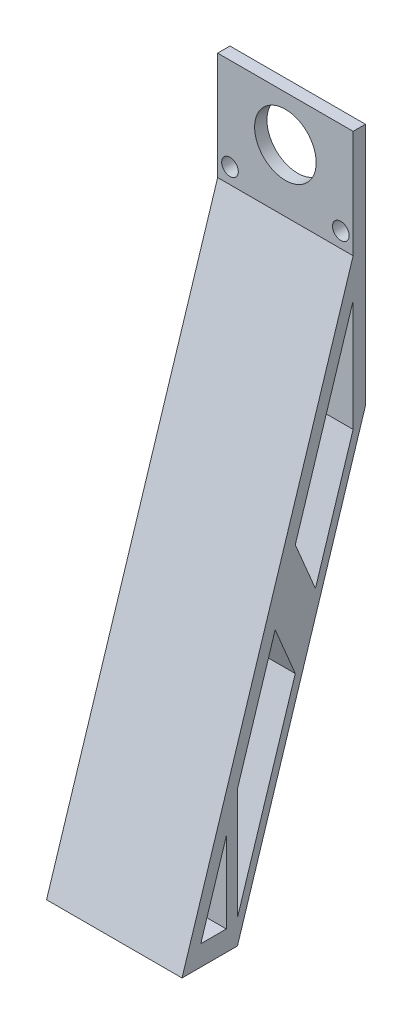
ISO-10303-21;
HEADER;
FILE_DESCRIPTION(('STEP AP214'),'2;1');
FILE_NAME('part.step','',(''),(''),'','','');
FILE_SCHEMA(('AUTOMOTIVE_DESIGN { 1 0 10303 214 1 1 1 1 }'));
ENDSEC;
DATA;
#1=APPLICATION_CONTEXT('core data for automotive mechanical design processes');
#2=APPLICATION_PROTOCOL_DEFINITION('international standard','automotive_design',2000,#1);
#3=PRODUCT_CONTEXT('',#1,'mechanical');
#4=PRODUCT('Part','Part','',(#3));
#5=PRODUCT_RELATED_PRODUCT_CATEGORY('part','',(#4));
#6=PRODUCT_DEFINITION_FORMATION('','',#4);
#7=PRODUCT_DEFINITION_CONTEXT('part definition',#1,'design');
#8=PRODUCT_DEFINITION('design','',#6,#7);
#9=PRODUCT_DEFINITION_SHAPE('','',#8);
#10=(LENGTH_UNIT() NAMED_UNIT(*) SI_UNIT(.MILLI.,.METRE.));
#11=(NAMED_UNIT(*) PLANE_ANGLE_UNIT() SI_UNIT($,.RADIAN.));
#12=(NAMED_UNIT(*) SI_UNIT($,.STERADIAN.) SOLID_ANGLE_UNIT());
#13=UNCERTAINTY_MEASURE_WITH_UNIT(LENGTH_MEASURE(1.E-05),#10,'distance_accuracy_value','');
#14=(GEOMETRIC_REPRESENTATION_CONTEXT(3) GLOBAL_UNCERTAINTY_ASSIGNED_CONTEXT((#13)) GLOBAL_UNIT_ASSIGNED_CONTEXT((#10,
#11,#12)) REPRESENTATION_CONTEXT('',''));
#15=CARTESIAN_POINT('',(0.,0.,0.));
#16=DIRECTION('',(0.,0.,1.));
#17=DIRECTION('',(1.,0.,0.));
#18=AXIS2_PLACEMENT_3D('',#15,#16,#17);
#19=CARTESIAN_POINT('',(1117.6,0.,0.));
#20=DIRECTION('',(0.,-0.302090479419242,-0.953279257219128));
#21=DIRECTION('',(0.,0.953279257219128,-0.302090479419241));
#22=AXIS2_PLACEMENT_3D('',#19,#20,#21);
#23=PLANE('',#22);
#24=DIRECTION('',(-1.,0.,0.));
#25=VECTOR('',#24,1.);
#26=CARTESIAN_POINT('',(1117.6,-1826.20178261922,578.71622386608));
#27=LINE('',#26,#25);
#28=CARTESIAN_POINT('',(1117.6,-1826.20178261922,578.71622386608));
#29=VERTEX_POINT('',#28);
#30=CARTESIAN_POINT('',(0.,-1826.20178261922,578.71622386608));
#31=VERTEX_POINT('',#30);
#32=EDGE_CURVE('E370',#29,#31,#27,.T.);
#33=ORIENTED_EDGE('',*,*,#32,.T.);
#34=DIRECTION('',(0.,-0.953279257219128,0.302090479419241));
#35=VECTOR('',#34,1.);
#36=CARTESIAN_POINT('',(0.,0.,0.));
#37=LINE('',#36,#35);
#38=CARTESIAN_POINT('',(0.,-320.609814382963,101.6));
#39=VERTEX_POINT('',#38);
#40=EDGE_CURVE('E234',#39,#31,#37,.T.);
#41=ORIENTED_EDGE('',*,*,#40,.F.);
#42=DIRECTION('',(-1.,0.,0.));
#43=VECTOR('',#42,1.);
#44=CARTESIAN_POINT('',(1117.6,-320.609814382963,101.6));
#45=LINE('',#44,#43);
#46=CARTESIAN_POINT('',(1117.6,-320.609814382963,101.6));
#47=VERTEX_POINT('',#46);
#48=EDGE_CURVE('E186',#47,#39,#45,.T.);
#49=ORIENTED_EDGE('',*,*,#48,.F.);
#50=DIRECTION('',(0.,-0.953279257219128,0.302090479419241));
#51=VECTOR('',#50,1.);
#52=CARTESIAN_POINT('',(1117.6,0.,0.));
#53=LINE('',#52,#51);
#54=EDGE_CURVE('E224',#47,#29,#53,.T.);
#55=ORIENTED_EDGE('',*,*,#54,.T.);
#56=EDGE_LOOP('',(#33,#41,#49,#55));
#57=FACE_BOUND('',#56,.T.);
#58=ADVANCED_FACE('F36',(#57),#23,.T.);
#59=CARTESIAN_POINT('',(1117.6,-1240.56770828313,101.6));
#60=DIRECTION('',(0.,0.302090479419242,0.953279257219128));
#61=DIRECTION('',(0.,-0.953279257219128,0.302090479419242));
#62=AXIS2_PLACEMENT_3D('',#59,#60,#61);
#63=PLANE('',#62);
#64=DIRECTION('',(-1.,0.,0.));
#65=VECTOR('',#64,1.);
#66=CARTESIAN_POINT('',(1117.6,-2222.10873170461,412.646522925539));
#67=LINE('',#66,#65);
#68=CARTESIAN_POINT('',(1117.6,-2222.10873170461,412.646522925539));
#69=VERTEX_POINT('',#68);
#70=CARTESIAN_POINT('',(0.,-2222.10873170462,412.646522925539));
#71=VERTEX_POINT('',#70);
#72=EDGE_CURVE('E382',#69,#71,#67,.T.);
#73=ORIENTED_EDGE('',*,*,#72,.F.);
#74=DIRECTION('',(0.,0.953279257219128,-0.302090479419242));
#75=VECTOR('',#74,1.);
#76=CARTESIAN_POINT('',(1117.6,-1240.56770828313,101.6));
#77=LINE('',#76,#75);
#78=CARTESIAN_POINT('',(1117.6,-1240.56770828313,101.6));
#79=VERTEX_POINT('',#78);
#80=EDGE_CURVE('E175',#69,#79,#77,.T.);
#81=ORIENTED_EDGE('',*,*,#80,.T.);
#82=DIRECTION('',(-1.,0.,0.));
#83=VECTOR('',#82,1.);
#84=CARTESIAN_POINT('',(1117.6,-1240.56770828313,101.6));
#85=LINE('',#84,#83);
#86=CARTESIAN_POINT('',(0.,-1240.56770828313,101.6));
#87=VERTEX_POINT('',#86);
#88=EDGE_CURVE('E177',#79,#87,#85,.T.);
#89=ORIENTED_EDGE('',*,*,#88,.T.);
#90=DIRECTION('',(0.,0.953279257219128,-0.302090479419242));
#91=VECTOR('',#90,1.);
#92=CARTESIAN_POINT('',(0.,-1240.56770828313,101.6));
#93=LINE('',#92,#91);
#94=EDGE_CURVE('E185',#71,#87,#93,.T.);
#95=ORIENTED_EDGE('',*,*,#94,.F.);
#96=EDGE_LOOP('',(#73,#81,#89,#95));
#97=FACE_BOUND('',#96,.T.);
#98=ADVANCED_FACE('F301',(#97),#63,.T.);
#99=DIRECTION('',(-1.,0.,0.));
#100=VECTOR('',#99,1.);
#101=CARTESIAN_POINT('',(1117.6,-2350.25272743399,744.785924806621));
#102=LINE('',#101,#100);
#103=CARTESIAN_POINT('',(1117.6,-2350.25272743399,744.785924806621));
#104=VERTEX_POINT('',#103);
#105=CARTESIAN_POINT('',(0.,-2350.252727434,744.785924806619));
#106=VERTEX_POINT('',#105);
#107=EDGE_CURVE('E160',#104,#106,#102,.T.);
#108=ORIENTED_EDGE('',*,*,#107,.F.);
#109=CARTESIAN_POINT('',(1117.6,-3331.79375085548,1055.83244773216));
#110=VERTEX_POINT('',#109);
#111=EDGE_CURVE('E170',#104,#110,#53,.T.);
#112=ORIENTED_EDGE('',*,*,#111,.T.);
#113=DIRECTION('',(-1.,0.,0.));
#114=VECTOR('',#113,1.);
#115=CARTESIAN_POINT('',(1117.6,-3331.79375085548,1055.83244773216));
#116=LINE('',#115,#114);
#117=CARTESIAN_POINT('',(0.,-3331.79375085548,1055.83244773216));
#118=VERTEX_POINT('',#117);
#119=EDGE_CURVE('E197',#110,#118,#116,.T.);
#120=ORIENTED_EDGE('',*,*,#119,.T.);
#121=EDGE_CURVE('E236',#106,#118,#37,.T.);
#122=ORIENTED_EDGE('',*,*,#121,.F.);
#123=EDGE_LOOP('',(#108,#112,#120,#122));
#124=FACE_BOUND('',#123,.T.);
#125=ADVANCED_FACE('F304',(#124),#23,.T.);
#126=CARTESIAN_POINT('',(1117.6,-4286.37525856448,1055.83244773216));
#127=DIRECTION('',(0.,1.,0.));
#128=DIRECTION('',(0.,0.,1.));
#129=AXIS2_PLACEMENT_3D('',#126,#127,#128);
#130=PLANE('',#129);
#131=DIRECTION('',(1.,0.,0.));
#132=VECTOR('',#131,1.);
#133=CARTESIAN_POINT('',(1117.6,-4286.37525856448,1147.60027143976));
#134=LINE('',#133,#132);
#135=CARTESIAN_POINT('',(0.,-4286.37525856448,1147.60027143976));
#136=VERTEX_POINT('',#135);
#137=CARTESIAN_POINT('',(1117.6,-4286.37525856448,1147.60027143976));
#138=VERTEX_POINT('',#137);
#139=EDGE_CURVE('E11',#136,#138,#134,.T.);
#140=ORIENTED_EDGE('',*,*,#139,.F.);
#141=DIRECTION('',(0.,0.,-1.));
#142=VECTOR('',#141,1.);
#143=CARTESIAN_POINT('',(0.,-4286.37525856448,1055.83244773216));
#144=LINE('',#143,#142);
#145=CARTESIAN_POINT('',(0.,-4286.37525856448,1358.33560525368));
#146=VERTEX_POINT('',#145);
#147=EDGE_CURVE('E200',#146,#136,#144,.T.);
#148=ORIENTED_EDGE('',*,*,#147,.F.);
#149=DIRECTION('',(-1.,0.,0.));
#150=VECTOR('',#149,1.);
#151=CARTESIAN_POINT('',(1117.6,-4286.37525856448,1358.33560525368));
#152=LINE('',#151,#150);
#153=CARTESIAN_POINT('',(1117.6,-4286.37525856448,1358.33560525368));
#154=VERTEX_POINT('',#153);
#155=EDGE_CURVE('E208',#154,#146,#152,.T.);
#156=ORIENTED_EDGE('',*,*,#155,.F.);
#157=DIRECTION('',(0.,0.,-1.));
#158=VECTOR('',#157,1.);
#159=CARTESIAN_POINT('',(1117.6,-4286.37525856448,1055.83244773216));
#160=LINE('',#159,#158);
#161=EDGE_CURVE('E202',#154,#138,#160,.T.);
#162=ORIENTED_EDGE('',*,*,#161,.T.);
#163=EDGE_LOOP('',(#140,#148,#156,#162));
#164=FACE_BOUND('',#163,.T.);
#165=ADVANCED_FACE('F313',(#164),#130,.T.);
#166=CARTESIAN_POINT('',(1117.6,0.,101.6));
#167=DIRECTION('',(-1.,0.,0.));
#168=DIRECTION('',(0.,0.,1.));
#169=AXIS2_PLACEMENT_3D('',#166,#167,#168);
#170=PLANE('',#169);
#171=DIRECTION('',(0.,-0.922157656081452,-0.3868142413748));
#172=VECTOR('',#171,1.);
#173=CARTESIAN_POINT('',(1117.6,-1826.20178261922,578.71622386608));
#174=LINE('',#173,#172);
#175=EDGE_CURVE('E161',#29,#69,#174,.T.);
#176=ORIENTED_EDGE('',*,*,#175,.F.);
#177=ORIENTED_EDGE('',*,*,#54,.F.);
#178=DIRECTION('',(0.,1.,0.));
#179=VECTOR('',#178,1.);
#180=CARTESIAN_POINT('',(1117.6,-1442.74416472334,101.6));
#181=LINE('',#180,#179);
#182=EDGE_CURVE('E377',#79,#47,#181,.T.);
#183=ORIENTED_EDGE('',*,*,#182,.F.);
#184=ORIENTED_EDGE('',*,*,#80,.F.);
#185=EDGE_LOOP('',(#176,#177,#183,#184));
#186=FACE_BOUND('',#185,.T.);
#187=ORIENTED_EDGE('',*,*,#111,.F.);
#188=DIRECTION('',(0.,0.922157656081452,0.3868142413748));
#189=VECTOR('',#188,1.);
#190=CARTESIAN_POINT('',(1117.6,-2746.15967651939,578.716223866079));
#191=LINE('',#190,#189);
#192=CARTESIAN_POINT('',(1117.6,-2746.15967651939,578.716223866079));
#193=VERTEX_POINT('',#192);
#194=EDGE_CURVE('E156',#193,#104,#191,.T.);
#195=ORIENTED_EDGE('',*,*,#194,.F.);
#196=CARTESIAN_POINT('',(1117.6,-4251.75164475564,1055.83244773216));
#197=VERTEX_POINT('',#196);
#198=EDGE_CURVE('E168',#197,#193,#77,.T.);
#199=ORIENTED_EDGE('',*,*,#198,.F.);
#200=DIRECTION('',(0.,-1.,0.));
#201=VECTOR('',#200,1.);
#202=CARTESIAN_POINT('',(1117.6,-4453.92810119586,1055.83244773216));
#203=LINE('',#202,#201);
#204=EDGE_CURVE('E205',#110,#197,#203,.T.);
#205=ORIENTED_EDGE('',*,*,#204,.F.);
#206=EDGE_LOOP('',(#187,#195,#199,#205));
#207=FACE_BOUND('',#206,.T.);
#208=DIRECTION('',(0.,1.,0.));
#209=VECTOR('',#208,1.);
#210=CARTESIAN_POINT('',(1117.6,-4288.35810024352,1147.60027143976));
#211=LINE('',#210,#209);
#212=CARTESIAN_POINT('',(1117.6,-3621.37706704861,1147.60027143976));
#213=VERTEX_POINT('',#212);
#214=EDGE_CURVE('E192',#138,#213,#211,.T.);
#215=ORIENTED_EDGE('',*,*,#214,.F.);
#216=ORIENTED_EDGE('',*,*,#161,.F.);
#217=EDGE_CURVE('E222',#213,#154,#53,.T.);
#218=ORIENTED_EDGE('',*,*,#217,.F.);
#219=EDGE_LOOP('',(#215,#216,#218));
#220=FACE_BOUND('',#219,.T.);
#221=DIRECTION('',(0.,-0.953279257219128,0.302090479419242));
#222=VECTOR('',#221,1.);
#223=CARTESIAN_POINT('',(1117.6,-1442.74416472334,101.6));
#224=LINE('',#223,#222);
#225=CARTESIAN_POINT('',(1117.6,-1122.13435034038,0.));
#226=VERTEX_POINT('',#225);
#227=CARTESIAN_POINT('',(1117.6,-4453.92810119586,1055.83244773216));
#228=VERTEX_POINT('',#227);
#229=EDGE_CURVE('E179',#226,#228,#224,.T.);
#230=ORIENTED_EDGE('',*,*,#229,.F.);
#231=DIRECTION('',(0.,1.,0.));
#232=VECTOR('',#231,1.);
#233=CARTESIAN_POINT('',(1117.6,0.,0.));
#234=LINE('',#233,#232);
#235=CARTESIAN_POINT('',(1117.6,889.,0.));
#236=VERTEX_POINT('',#235);
#237=EDGE_CURVE('E263',#226,#236,#234,.T.);
#238=ORIENTED_EDGE('',*,*,#237,.T.);
#239=DIRECTION('',(0.,0.,-1.));
#240=VECTOR('',#239,1.);
#241=CARTESIAN_POINT('',(1117.6,889.,101.6));
#242=LINE('',#241,#240);
#243=CARTESIAN_POINT('',(1117.6,889.,101.6));
#244=VERTEX_POINT('',#243);
#245=EDGE_CURVE('E44',#244,#236,#242,.T.);
#246=ORIENTED_EDGE('',*,*,#245,.F.);
#247=DIRECTION('',(0.,1.,0.));
#248=VECTOR('',#247,1.);
#249=CARTESIAN_POINT('',(1117.6,0.,101.6));
#250=LINE('',#249,#248);
#251=CARTESIAN_POINT('',(1117.6,0.,101.6));
#252=VERTEX_POINT('',#251);
#253=EDGE_CURVE('E253',#252,#244,#250,.T.);
#254=ORIENTED_EDGE('',*,*,#253,.F.);
#255=DIRECTION('',(0.,0.953279257219128,-0.302090479419241));
#256=VECTOR('',#255,1.);
#257=CARTESIAN_POINT('',(1117.6,-4453.92810119586,1513.03244773216));
#258=LINE('',#257,#256);
#259=CARTESIAN_POINT('',(1117.6,-4453.92810119586,1513.03244773216));
#260=VERTEX_POINT('',#259);
#261=EDGE_CURVE('E227',#260,#252,#258,.T.);
#262=ORIENTED_EDGE('',*,*,#261,.F.);
#263=DIRECTION('',(0.,0.,-1.));
#264=VECTOR('',#263,1.);
#265=CARTESIAN_POINT('',(1117.6,-4453.92810119586,1513.03244773216));
#266=LINE('',#265,#264);
#267=EDGE_CURVE('E219',#260,#228,#266,.T.);
#268=ORIENTED_EDGE('',*,*,#267,.T.);
#269=EDGE_LOOP('',(#230,#238,#246,#254,#262,#268));
#270=FACE_BOUND('',#269,.T.);
#271=ADVANCED_FACE('F38',(#186,#207,#220,#270),#170,.F.);
#272=CARTESIAN_POINT('',(0.,889.,101.6));
#273=DIRECTION('',(0.,1.,0.));
#274=DIRECTION('',(0.,0.,1.));
#275=AXIS2_PLACEMENT_3D('',#272,#273,#274);
#276=PLANE('',#275);
#277=DIRECTION('',(1.,0.,0.));
#278=VECTOR('',#277,1.);
#279=CARTESIAN_POINT('',(0.,889.,0.));
#280=LINE('',#279,#278);
#281=CARTESIAN_POINT('',(0.,889.,0.));
#282=VERTEX_POINT('',#281);
#283=EDGE_CURVE('E266',#282,#236,#280,.T.);
#284=ORIENTED_EDGE('',*,*,#283,.F.);
#285=DIRECTION('',(0.,0.,-1.));
#286=VECTOR('',#285,1.);
#287=CARTESIAN_POINT('',(0.,889.,101.6));
#288=LINE('',#287,#286);
#289=CARTESIAN_POINT('',(0.,889.,101.6));
#290=VERTEX_POINT('',#289);
#291=EDGE_CURVE('E262',#290,#282,#288,.T.);
#292=ORIENTED_EDGE('',*,*,#291,.F.);
#293=DIRECTION('',(1.,0.,0.));
#294=VECTOR('',#293,1.);
#295=CARTESIAN_POINT('',(0.,889.,101.6));
#296=LINE('',#295,#294);
#297=EDGE_CURVE('E256',#290,#244,#296,.T.);
#298=ORIENTED_EDGE('',*,*,#297,.T.);
#299=ORIENTED_EDGE('',*,*,#245,.T.);
#300=EDGE_LOOP('',(#284,#292,#298,#299));
#301=FACE_BOUND('',#300,.T.);
#302=ADVANCED_FACE('F356',(#301),#276,.T.);
#303=CARTESIAN_POINT('',(0.,0.,101.6));
#304=DIRECTION('',(-1.,0.,0.));
#305=DIRECTION('',(0.,0.,1.));
#306=AXIS2_PLACEMENT_3D('',#303,#304,#305);
#307=PLANE('',#306);
#308=ORIENTED_EDGE('',*,*,#40,.T.);
#309=DIRECTION('',(0.,-0.922157656081452,-0.3868142413748));
#310=VECTOR('',#309,1.);
#311=CARTESIAN_POINT('',(0.,-1826.20178261922,578.71622386608));
#312=LINE('',#311,#310);
#313=EDGE_CURVE('E59',#31,#71,#312,.T.);
#314=ORIENTED_EDGE('',*,*,#313,.T.);
#315=ORIENTED_EDGE('',*,*,#94,.T.);
#316=DIRECTION('',(0.,1.,0.));
#317=VECTOR('',#316,1.);
#318=CARTESIAN_POINT('',(0.,-1442.74416472334,101.6));
#319=LINE('',#318,#317);
#320=EDGE_CURVE('E380',#87,#39,#319,.T.);
#321=ORIENTED_EDGE('',*,*,#320,.T.);
#322=EDGE_LOOP('',(#308,#314,#315,#321));
#323=FACE_BOUND('',#322,.T.);
#324=DIRECTION('',(0.,0.922157656081452,0.3868142413748));
#325=VECTOR('',#324,1.);
#326=CARTESIAN_POINT('',(0.,-2746.15967651939,578.716223866079));
#327=LINE('',#326,#325);
#328=CARTESIAN_POINT('',(0.,-2746.15967651939,578.716223866079));
#329=VERTEX_POINT('',#328);
#330=EDGE_CURVE('E51',#329,#106,#327,.T.);
#331=ORIENTED_EDGE('',*,*,#330,.T.);
#332=ORIENTED_EDGE('',*,*,#121,.T.);
#333=DIRECTION('',(0.,-1.,0.));
#334=VECTOR('',#333,1.);
#335=CARTESIAN_POINT('',(0.,-4453.92810119586,1055.83244773216));
#336=LINE('',#335,#334);
#337=CARTESIAN_POINT('',(0.,-4251.75164475564,1055.83244773216));
#338=VERTEX_POINT('',#337);
#339=EDGE_CURVE('E206',#118,#338,#336,.T.);
#340=ORIENTED_EDGE('',*,*,#339,.T.);
#341=EDGE_CURVE('E187',#338,#329,#93,.T.);
#342=ORIENTED_EDGE('',*,*,#341,.T.);
#343=EDGE_LOOP('',(#331,#332,#340,#342));
#344=FACE_BOUND('',#343,.T.);
#345=ORIENTED_EDGE('',*,*,#147,.T.);
#346=DIRECTION('',(0.,1.,0.));
#347=VECTOR('',#346,1.);
#348=CARTESIAN_POINT('',(0.,-4288.35810024352,1147.60027143976));
#349=LINE('',#348,#347);
#350=CARTESIAN_POINT('',(0.,-3621.37706704861,1147.60027143976));
#351=VERTEX_POINT('',#350);
#352=EDGE_CURVE('E190',#136,#351,#349,.T.);
#353=ORIENTED_EDGE('',*,*,#352,.T.);
#354=EDGE_CURVE('E233',#351,#146,#37,.T.);
#355=ORIENTED_EDGE('',*,*,#354,.T.);
#356=EDGE_LOOP('',(#345,#353,#355));
#357=FACE_BOUND('',#356,.T.);
#358=DIRECTION('',(0.,1.,0.));
#359=VECTOR('',#358,1.);
#360=CARTESIAN_POINT('',(0.,0.,0.));
#361=LINE('',#360,#359);
#362=CARTESIAN_POINT('',(0.,-1122.13435034038,0.));
#363=VERTEX_POINT('',#362);
#364=EDGE_CURVE('E254',#363,#282,#361,.T.);
#365=ORIENTED_EDGE('',*,*,#364,.F.);
#366=DIRECTION('',(0.,-0.953279257219128,0.302090479419242));
#367=VECTOR('',#366,1.);
#368=CARTESIAN_POINT('',(0.,-1442.74416472334,101.6));
#369=LINE('',#368,#367);
#370=CARTESIAN_POINT('',(0.,-4453.92810119586,1055.83244773216));
#371=VERTEX_POINT('',#370);
#372=EDGE_CURVE('E183',#363,#371,#369,.T.);
#373=ORIENTED_EDGE('',*,*,#372,.T.);
#374=DIRECTION('',(0.,0.,-1.));
#375=VECTOR('',#374,1.);
#376=CARTESIAN_POINT('',(0.,-4453.92810119586,1513.03244773216));
#377=LINE('',#376,#375);
#378=CARTESIAN_POINT('',(0.,-4453.92810119586,1513.03244773216));
#379=VERTEX_POINT('',#378);
#380=EDGE_CURVE('E216',#379,#371,#377,.T.);
#381=ORIENTED_EDGE('',*,*,#380,.F.);
#382=DIRECTION('',(0.,0.953279257219128,-0.302090479419241));
#383=VECTOR('',#382,1.);
#384=CARTESIAN_POINT('',(0.,-4453.92810119586,1513.03244773216));
#385=LINE('',#384,#383);
#386=CARTESIAN_POINT('',(0.,0.,101.6));
#387=VERTEX_POINT('',#386);
#388=EDGE_CURVE('E223',#379,#387,#385,.T.);
#389=ORIENTED_EDGE('',*,*,#388,.T.);
#390=DIRECTION('',(0.,1.,0.));
#391=VECTOR('',#390,1.);
#392=CARTESIAN_POINT('',(0.,0.,101.6));
#393=LINE('',#392,#391);
#394=EDGE_CURVE('E259',#387,#290,#393,.T.);
#395=ORIENTED_EDGE('',*,*,#394,.T.);
#396=ORIENTED_EDGE('',*,*,#291,.T.);
#397=EDGE_LOOP('',(#365,#373,#381,#389,#395,#396));
#398=FACE_BOUND('',#397,.T.);
#399=ADVANCED_FACE('F335',(#323,#344,#357,#398),#307,.T.);
#400=CARTESIAN_POINT('',(0.,0.,101.6));
#401=DIRECTION('',(0.,0.,1.));
#402=DIRECTION('',(1.,0.,0.));
#403=AXIS2_PLACEMENT_3D('',#400,#401,#402);
#404=PLANE('',#403);
#405=CARTESIAN_POINT('',(1016.,127.,101.6));
#406=DIRECTION('',(0.,0.,1.));
#407=DIRECTION('',(1.,0.,0.));
#408=AXIS2_PLACEMENT_3D('',#405,#406,#407);
#409=CIRCLE('',#408,68.58);
#410=CARTESIAN_POINT('',(1084.58,127.,101.6));
#411=VERTEX_POINT('',#410);
#412=EDGE_CURVE('E241',#411,#411,#409,.T.);
#413=ORIENTED_EDGE('',*,*,#412,.F.);
#414=EDGE_LOOP('',(#413));
#415=FACE_BOUND('',#414,.T.);
#416=CARTESIAN_POINT('',(101.6,127.,101.6));
#417=DIRECTION('',(0.,0.,1.));
#418=DIRECTION('',(1.,0.,0.));
#419=AXIS2_PLACEMENT_3D('',#416,#417,#418);
#420=CIRCLE('',#419,68.58);
#421=CARTESIAN_POINT('',(170.18,127.,101.6));
#422=VERTEX_POINT('',#421);
#423=EDGE_CURVE('E245',#422,#422,#420,.T.);
#424=ORIENTED_EDGE('',*,*,#423,.F.);
#425=EDGE_LOOP('',(#424));
#426=FACE_BOUND('',#425,.T.);
#427=CARTESIAN_POINT('',(558.8,513.08,101.6));
#428=DIRECTION('',(0.,0.,1.));
#429=DIRECTION('',(1.,0.,0.));
#430=AXIS2_PLACEMENT_3D('',#427,#428,#429);
#431=CIRCLE('',#430,254.);
#432=CARTESIAN_POINT('',(812.8,513.08,101.6));
#433=VERTEX_POINT('',#432);
#434=EDGE_CURVE('E240',#433,#433,#431,.T.);
#435=ORIENTED_EDGE('',*,*,#434,.F.);
#436=EDGE_LOOP('',(#435));
#437=FACE_BOUND('',#436,.T.);
#438=DIRECTION('',(1.,0.,0.));
#439=VECTOR('',#438,1.);
#440=CARTESIAN_POINT('',(0.,0.,101.6));
#441=LINE('',#440,#439);
#442=EDGE_CURVE('E250',#387,#252,#441,.T.);
#443=ORIENTED_EDGE('',*,*,#442,.T.);
#444=ORIENTED_EDGE('',*,*,#253,.T.);
#445=ORIENTED_EDGE('',*,*,#297,.F.);
#446=ORIENTED_EDGE('',*,*,#394,.F.);
#447=EDGE_LOOP('',(#443,#444,#445,#446));
#448=FACE_BOUND('',#447,.T.);
#449=ADVANCED_FACE('F424',(#415,#426,#437,#448),#404,.T.);
#450=CARTESIAN_POINT('',(0.,0.,0.));
#451=DIRECTION('',(0.,0.,1.));
#452=DIRECTION('',(1.,0.,0.));
#453=AXIS2_PLACEMENT_3D('',#450,#451,#452);
#454=PLANE('',#453);
#455=CARTESIAN_POINT('',(1016.,127.,0.));
#456=DIRECTION('',(0.,0.,1.));
#457=DIRECTION('',(1.,0.,0.));
#458=AXIS2_PLACEMENT_3D('',#455,#456,#457);
#459=CIRCLE('',#458,68.58);
#460=CARTESIAN_POINT('',(1084.58,127.,0.));
#461=VERTEX_POINT('',#460);
#462=EDGE_CURVE('E267',#461,#461,#459,.T.);
#463=ORIENTED_EDGE('',*,*,#462,.T.);
#464=EDGE_LOOP('',(#463));
#465=FACE_BOUND('',#464,.T.);
#466=CARTESIAN_POINT('',(101.6,127.,0.));
#467=DIRECTION('',(0.,0.,1.));
#468=DIRECTION('',(1.,0.,0.));
#469=AXIS2_PLACEMENT_3D('',#466,#467,#468);
#470=CIRCLE('',#469,68.58);
#471=CARTESIAN_POINT('',(170.18,127.,0.));
#472=VERTEX_POINT('',#471);
#473=EDGE_CURVE('E276',#472,#472,#470,.T.);
#474=ORIENTED_EDGE('',*,*,#473,.T.);
#475=EDGE_LOOP('',(#474));
#476=FACE_BOUND('',#475,.T.);
#477=CARTESIAN_POINT('',(558.8,513.08,0.));
#478=DIRECTION('',(0.,0.,1.));
#479=DIRECTION('',(1.,0.,0.));
#480=AXIS2_PLACEMENT_3D('',#477,#478,#479);
#481=CIRCLE('',#480,254.);
#482=CARTESIAN_POINT('',(812.8,513.08,0.));
#483=VERTEX_POINT('',#482);
#484=EDGE_CURVE('E244',#483,#483,#481,.T.);
#485=ORIENTED_EDGE('',*,*,#484,.T.);
#486=EDGE_LOOP('',(#485));
#487=FACE_BOUND('',#486,.T.);
#488=ORIENTED_EDGE('',*,*,#237,.F.);
#489=DIRECTION('',(-1.,0.,0.));
#490=VECTOR('',#489,1.);
#491=CARTESIAN_POINT('',(1117.6,-1122.13435034038,0.));
#492=LINE('',#491,#490);
#493=EDGE_CURVE('E375',#226,#363,#492,.T.);
#494=ORIENTED_EDGE('',*,*,#493,.T.);
#495=ORIENTED_EDGE('',*,*,#364,.T.);
#496=ORIENTED_EDGE('',*,*,#283,.T.);
#497=EDGE_LOOP('',(#488,#494,#495,#496));
#498=FACE_BOUND('',#497,.T.);
#499=ADVANCED_FACE('F281',(#465,#476,#487,#498),#454,.F.);
#500=CARTESIAN_POINT('',(558.8,513.08,-391.16));
#501=DIRECTION('',(0.,0.,1.));
#502=DIRECTION('',(1.,0.,0.));
#503=AXIS2_PLACEMENT_3D('',#500,#501,#502);
#504=CYLINDRICAL_SURFACE('',#503,254.);
#505=CARTESIAN_POINT('',(812.8,513.08,101.6));
#506=CARTESIAN_POINT('',(812.8,513.08,100.541666666667));
#507=CARTESIAN_POINT('',(812.8,513.08,99.4833333333333));
#508=CARTESIAN_POINT('',(812.8,513.08,97.3666666666666));
#509=CARTESIAN_POINT('',(812.8,513.08,96.3083333333333));
#510=CARTESIAN_POINT('',(812.8,513.08,94.1916666666666));
#511=CARTESIAN_POINT('',(812.8,513.08,93.1333333333333));
#512=CARTESIAN_POINT('',(812.8,513.08,91.0166666666666));
#513=CARTESIAN_POINT('',(812.8,513.08,89.9583333333333));
#514=CARTESIAN_POINT('',(812.8,513.08,87.8416666666666));
#515=CARTESIAN_POINT('',(812.8,513.08,86.7833333333333));
#516=CARTESIAN_POINT('',(812.8,513.08,84.6666666666666));
#517=CARTESIAN_POINT('',(812.8,513.08,83.6083333333333));
#518=CARTESIAN_POINT('',(812.8,513.08,81.4916666666666));
#519=CARTESIAN_POINT('',(812.8,513.08,80.4333333333333));
#520=CARTESIAN_POINT('',(812.8,513.08,78.3166666666666));
#521=CARTESIAN_POINT('',(812.8,513.08,77.2583333333333));
#522=CARTESIAN_POINT('',(812.8,513.08,75.1416666666667));
#523=CARTESIAN_POINT('',(812.8,513.08,74.0833333333333));
#524=CARTESIAN_POINT('',(812.8,513.08,71.9666666666666));
#525=CARTESIAN_POINT('',(812.8,513.08,70.9083333333333));
#526=CARTESIAN_POINT('',(812.8,513.08,68.7916666666666));
#527=CARTESIAN_POINT('',(812.8,513.08,67.7333333333333));
#528=CARTESIAN_POINT('',(812.8,513.08,65.6166666666666));
#529=CARTESIAN_POINT('',(812.8,513.08,64.5583333333333));
#530=CARTESIAN_POINT('',(812.8,513.08,62.4416666666666));
#531=CARTESIAN_POINT('',(812.8,513.08,61.3833333333333));
#532=CARTESIAN_POINT('',(812.8,513.08,59.2666666666666));
#533=CARTESIAN_POINT('',(812.8,513.08,58.2083333333333));
#534=CARTESIAN_POINT('',(812.8,513.08,56.0916666666666));
#535=CARTESIAN_POINT('',(812.8,513.08,55.0333333333333));
#536=CARTESIAN_POINT('',(812.8,513.08,52.9166666666666));
#537=CARTESIAN_POINT('',(812.8,513.08,51.8583333333333));
#538=CARTESIAN_POINT('',(812.8,513.08,49.7416666666666));
#539=CARTESIAN_POINT('',(812.8,513.08,48.6833333333333));
#540=CARTESIAN_POINT('',(812.8,513.08,46.5666666666666));
#541=CARTESIAN_POINT('',(812.8,513.08,45.5083333333333));
#542=CARTESIAN_POINT('',(812.8,513.08,43.3916666666666));
#543=CARTESIAN_POINT('',(812.8,513.08,42.3333333333333));
#544=CARTESIAN_POINT('',(812.8,513.08,40.2166666666666));
#545=CARTESIAN_POINT('',(812.8,513.08,39.1583333333333));
#546=CARTESIAN_POINT('',(812.8,513.08,37.0416666666666));
#547=CARTESIAN_POINT('',(812.8,513.08,35.9833333333333));
#548=CARTESIAN_POINT('',(812.8,513.08,33.8666666666666));
#549=CARTESIAN_POINT('',(812.8,513.08,32.8083333333333));
#550=CARTESIAN_POINT('',(812.8,513.08,30.6916666666666));
#551=CARTESIAN_POINT('',(812.8,513.08,29.6333333333333));
#552=CARTESIAN_POINT('',(812.8,513.08,27.5166666666666));
#553=CARTESIAN_POINT('',(812.8,513.08,26.4583333333333));
#554=CARTESIAN_POINT('',(812.8,513.08,24.3416666666666));
#555=CARTESIAN_POINT('',(812.8,513.08,23.2833333333333));
#556=CARTESIAN_POINT('',(812.8,513.08,21.1666666666666));
#557=CARTESIAN_POINT('',(812.8,513.08,20.1083333333333));
#558=CARTESIAN_POINT('',(812.8,513.08,17.9916666666666));
#559=CARTESIAN_POINT('',(812.8,513.08,16.9333333333333));
#560=CARTESIAN_POINT('',(812.8,513.08,14.8166666666666));
#561=CARTESIAN_POINT('',(812.8,513.08,13.7583333333333));
#562=CARTESIAN_POINT('',(812.8,513.08,11.6416666666666));
#563=CARTESIAN_POINT('',(812.8,513.08,10.5833333333333));
#564=CARTESIAN_POINT('',(812.8,513.08,8.4666666666666));
#565=CARTESIAN_POINT('',(812.8,513.08,7.40833333333326));
#566=CARTESIAN_POINT('',(812.8,513.08,5.29166666666658));
#567=CARTESIAN_POINT('',(812.8,513.08,4.23333333333326));
#568=CARTESIAN_POINT('',(812.8,513.08,2.1166666666666));
#569=CARTESIAN_POINT('',(812.8,513.08,1.05833333333327));
#570=CARTESIAN_POINT('',(812.8,513.08,0.));
#571=B_SPLINE_CURVE_WITH_KNOTS('',3,(#505,#506,#507,#508,#509,#510,#511,#512,#513,#514,#515,
#516,#517,#518,#519,#520,#521,#522,#523,#524,#525,#526,#527,#528,#529,#530,#531,#532,#533,#534,
#535,#536,#537,#538,#539,#540,#541,#542,#543,#544,#545,#546,#547,#548,#549,#550,#551,#552,#553,
#554,#555,#556,#557,#558,#559,#560,#561,#562,#563,#564,#565,#566,#567,#568,#569,#570),
.UNSPECIFIED.,.F.,.F.,(4,2,2,2,2,2,2,2,2,2,2,2,2,2,2,2,2,2,2,2,2,2,2,2,2,2,2,2,2,2,2,2,4),(0.,
3.17499999999998,6.35000000000002,9.52500000000001,12.7,15.875,19.05,22.225,25.4,28.575,31.75,
34.925,38.1,41.275,44.45,47.625,50.8,53.975,57.15,60.325,63.5,66.675,69.85,73.025,76.2,79.375,
82.55,85.7250000000001,88.9,92.075,95.2500000000001,98.425,101.6),.UNSPECIFIED.);
#572=EDGE_CURVE('BSEAM297',#433,#483,#571,.T.);
#573=ORIENTED_EDGE('',*,*,#434,.T.);
#574=ORIENTED_EDGE('',*,*,#484,.F.);
#575=ORIENTED_EDGE('',*,*,#572,.T.);
#576=ORIENTED_EDGE('',*,*,#572,.F.);
#577=EDGE_LOOP('',(#573,#575,#574,#576));
#578=FACE_BOUND('',#577,.T.);
#579=ADVANCED_FACE('F297',(#578),#504,.F.);
#580=CARTESIAN_POINT('',(101.6,127.,-391.16));
#581=DIRECTION('',(0.,0.,1.));
#582=DIRECTION('',(1.,0.,0.));
#583=AXIS2_PLACEMENT_3D('',#580,#581,#582);
#584=CYLINDRICAL_SURFACE('',#583,68.58);
#585=CARTESIAN_POINT('',(170.18,127.,101.6));
#586=CARTESIAN_POINT('',(170.18,127.,100.541666666667));
#587=CARTESIAN_POINT('',(170.18,127.,99.4833333333333));
#588=CARTESIAN_POINT('',(170.18,127.,97.3666666666666));
#589=CARTESIAN_POINT('',(170.18,127.,96.3083333333333));
#590=CARTESIAN_POINT('',(170.18,127.,94.1916666666666));
#591=CARTESIAN_POINT('',(170.18,127.,93.1333333333333));
#592=CARTESIAN_POINT('',(170.18,127.,91.0166666666666));
#593=CARTESIAN_POINT('',(170.18,127.,89.9583333333333));
#594=CARTESIAN_POINT('',(170.18,127.,87.8416666666666));
#595=CARTESIAN_POINT('',(170.18,127.,86.7833333333333));
#596=CARTESIAN_POINT('',(170.18,127.,84.6666666666666));
#597=CARTESIAN_POINT('',(170.18,127.,83.6083333333333));
#598=CARTESIAN_POINT('',(170.18,127.,81.4916666666666));
#599=CARTESIAN_POINT('',(170.18,127.,80.4333333333333));
#600=CARTESIAN_POINT('',(170.18,127.,78.3166666666666));
#601=CARTESIAN_POINT('',(170.18,127.,77.2583333333333));
#602=CARTESIAN_POINT('',(170.18,127.,75.1416666666667));
#603=CARTESIAN_POINT('',(170.18,127.,74.0833333333333));
#604=CARTESIAN_POINT('',(170.18,127.,71.9666666666666));
#605=CARTESIAN_POINT('',(170.18,127.,70.9083333333333));
#606=CARTESIAN_POINT('',(170.18,127.,68.7916666666666));
#607=CARTESIAN_POINT('',(170.18,127.,67.7333333333333));
#608=CARTESIAN_POINT('',(170.18,127.,65.6166666666666));
#609=CARTESIAN_POINT('',(170.18,127.,64.5583333333333));
#610=CARTESIAN_POINT('',(170.18,127.,62.4416666666666));
#611=CARTESIAN_POINT('',(170.18,127.,61.3833333333333));
#612=CARTESIAN_POINT('',(170.18,127.,59.2666666666666));
#613=CARTESIAN_POINT('',(170.18,127.,58.2083333333333));
#614=CARTESIAN_POINT('',(170.18,127.,56.0916666666666));
#615=CARTESIAN_POINT('',(170.18,127.,55.0333333333333));
#616=CARTESIAN_POINT('',(170.18,127.,52.9166666666666));
#617=CARTESIAN_POINT('',(170.18,127.,51.8583333333333));
#618=CARTESIAN_POINT('',(170.18,127.,49.7416666666666));
#619=CARTESIAN_POINT('',(170.18,127.,48.6833333333333));
#620=CARTESIAN_POINT('',(170.18,127.,46.5666666666666));
#621=CARTESIAN_POINT('',(170.18,127.,45.5083333333333));
#622=CARTESIAN_POINT('',(170.18,127.,43.3916666666666));
#623=CARTESIAN_POINT('',(170.18,127.,42.3333333333333));
#624=CARTESIAN_POINT('',(170.18,127.,40.2166666666666));
#625=CARTESIAN_POINT('',(170.18,127.,39.1583333333333));
#626=CARTESIAN_POINT('',(170.18,127.,37.0416666666666));
#627=CARTESIAN_POINT('',(170.18,127.,35.9833333333333));
#628=CARTESIAN_POINT('',(170.18,127.,33.8666666666666));
#629=CARTESIAN_POINT('',(170.18,127.,32.8083333333333));
#630=CARTESIAN_POINT('',(170.18,127.,30.6916666666666));
#631=CARTESIAN_POINT('',(170.18,127.,29.6333333333333));
#632=CARTESIAN_POINT('',(170.18,127.,27.5166666666666));
#633=CARTESIAN_POINT('',(170.18,127.,26.4583333333333));
#634=CARTESIAN_POINT('',(170.18,127.,24.3416666666666));
#635=CARTESIAN_POINT('',(170.18,127.,23.2833333333333));
#636=CARTESIAN_POINT('',(170.18,127.,21.1666666666666));
#637=CARTESIAN_POINT('',(170.18,127.,20.1083333333333));
#638=CARTESIAN_POINT('',(170.18,127.,17.9916666666666));
#639=CARTESIAN_POINT('',(170.18,127.,16.9333333333333));
#640=CARTESIAN_POINT('',(170.18,127.,14.8166666666666));
#641=CARTESIAN_POINT('',(170.18,127.,13.7583333333333));
#642=CARTESIAN_POINT('',(170.18,127.,11.6416666666666));
#643=CARTESIAN_POINT('',(170.18,127.,10.5833333333333));
#644=CARTESIAN_POINT('',(170.18,127.,8.4666666666666));
#645=CARTESIAN_POINT('',(170.18,127.,7.40833333333326));
#646=CARTESIAN_POINT('',(170.18,127.,5.29166666666658));
#647=CARTESIAN_POINT('',(170.18,127.,4.23333333333326));
#648=CARTESIAN_POINT('',(170.18,127.,2.1166666666666));
#649=CARTESIAN_POINT('',(170.18,127.,1.05833333333327));
#650=CARTESIAN_POINT('',(170.18,127.,0.));
#651=B_SPLINE_CURVE_WITH_KNOTS('',3,(#585,#586,#587,#588,#589,#590,#591,#592,#593,#594,#595,
#596,#597,#598,#599,#600,#601,#602,#603,#604,#605,#606,#607,#608,#609,#610,#611,#612,#613,#614,
#615,#616,#617,#618,#619,#620,#621,#622,#623,#624,#625,#626,#627,#628,#629,#630,#631,#632,#633,
#634,#635,#636,#637,#638,#639,#640,#641,#642,#643,#644,#645,#646,#647,#648,#649,#650),
.UNSPECIFIED.,.F.,.F.,(4,2,2,2,2,2,2,2,2,2,2,2,2,2,2,2,2,2,2,2,2,2,2,2,2,2,2,2,2,2,2,2,4),(0.,
3.17499999999998,6.35000000000002,9.52500000000001,12.7,15.875,19.05,22.225,25.4,28.575,31.75,
34.925,38.1,41.275,44.45,47.625,50.8,53.975,57.15,60.325,63.5,66.675,69.85,73.025,76.2,79.375,
82.55,85.7250000000001,88.9,92.075,95.2500000000001,98.425,101.6),.UNSPECIFIED.);
#652=EDGE_CURVE('BSEAM287',#422,#472,#651,.T.);
#653=ORIENTED_EDGE('',*,*,#423,.T.);
#654=ORIENTED_EDGE('',*,*,#473,.F.);
#655=ORIENTED_EDGE('',*,*,#652,.T.);
#656=ORIENTED_EDGE('',*,*,#652,.F.);
#657=EDGE_LOOP('',(#653,#655,#654,#656));
#658=FACE_BOUND('',#657,.T.);
#659=ADVANCED_FACE('F287',(#658),#584,.F.);
#660=CARTESIAN_POINT('',(1016.,127.,-391.16));
#661=DIRECTION('',(0.,0.,1.));
#662=DIRECTION('',(1.,0.,0.));
#663=AXIS2_PLACEMENT_3D('',#660,#661,#662);
#664=CYLINDRICAL_SURFACE('',#663,68.58);
#665=CARTESIAN_POINT('',(1084.58,127.,101.6));
#666=CARTESIAN_POINT('',(1084.58,127.,100.541666666667));
#667=CARTESIAN_POINT('',(1084.58,127.,99.4833333333333));
#668=CARTESIAN_POINT('',(1084.58,127.,97.3666666666666));
#669=CARTESIAN_POINT('',(1084.58,127.,96.3083333333333));
#670=CARTESIAN_POINT('',(1084.58,127.,94.1916666666666));
#671=CARTESIAN_POINT('',(1084.58,127.,93.1333333333333));
#672=CARTESIAN_POINT('',(1084.58,127.,91.0166666666666));
#673=CARTESIAN_POINT('',(1084.58,127.,89.9583333333333));
#674=CARTESIAN_POINT('',(1084.58,127.,87.8416666666666));
#675=CARTESIAN_POINT('',(1084.58,127.,86.7833333333333));
#676=CARTESIAN_POINT('',(1084.58,127.,84.6666666666666));
#677=CARTESIAN_POINT('',(1084.58,127.,83.6083333333333));
#678=CARTESIAN_POINT('',(1084.58,127.,81.4916666666666));
#679=CARTESIAN_POINT('',(1084.58,127.,80.4333333333333));
#680=CARTESIAN_POINT('',(1084.58,127.,78.3166666666666));
#681=CARTESIAN_POINT('',(1084.58,127.,77.2583333333333));
#682=CARTESIAN_POINT('',(1084.58,127.,75.1416666666667));
#683=CARTESIAN_POINT('',(1084.58,127.,74.0833333333333));
#684=CARTESIAN_POINT('',(1084.58,127.,71.9666666666666));
#685=CARTESIAN_POINT('',(1084.58,127.,70.9083333333333));
#686=CARTESIAN_POINT('',(1084.58,127.,68.7916666666666));
#687=CARTESIAN_POINT('',(1084.58,127.,67.7333333333333));
#688=CARTESIAN_POINT('',(1084.58,127.,65.6166666666666));
#689=CARTESIAN_POINT('',(1084.58,127.,64.5583333333333));
#690=CARTESIAN_POINT('',(1084.58,127.,62.4416666666666));
#691=CARTESIAN_POINT('',(1084.58,127.,61.3833333333333));
#692=CARTESIAN_POINT('',(1084.58,127.,59.2666666666666));
#693=CARTESIAN_POINT('',(1084.58,127.,58.2083333333333));
#694=CARTESIAN_POINT('',(1084.58,127.,56.0916666666666));
#695=CARTESIAN_POINT('',(1084.58,127.,55.0333333333333));
#696=CARTESIAN_POINT('',(1084.58,127.,52.9166666666666));
#697=CARTESIAN_POINT('',(1084.58,127.,51.8583333333333));
#698=CARTESIAN_POINT('',(1084.58,127.,49.7416666666666));
#699=CARTESIAN_POINT('',(1084.58,127.,48.6833333333333));
#700=CARTESIAN_POINT('',(1084.58,127.,46.5666666666666));
#701=CARTESIAN_POINT('',(1084.58,127.,45.5083333333333));
#702=CARTESIAN_POINT('',(1084.58,127.,43.3916666666666));
#703=CARTESIAN_POINT('',(1084.58,127.,42.3333333333333));
#704=CARTESIAN_POINT('',(1084.58,127.,40.2166666666666));
#705=CARTESIAN_POINT('',(1084.58,127.,39.1583333333333));
#706=CARTESIAN_POINT('',(1084.58,127.,37.0416666666666));
#707=CARTESIAN_POINT('',(1084.58,127.,35.9833333333333));
#708=CARTESIAN_POINT('',(1084.58,127.,33.8666666666666));
#709=CARTESIAN_POINT('',(1084.58,127.,32.8083333333333));
#710=CARTESIAN_POINT('',(1084.58,127.,30.6916666666666));
#711=CARTESIAN_POINT('',(1084.58,127.,29.6333333333333));
#712=CARTESIAN_POINT('',(1084.58,127.,27.5166666666666));
#713=CARTESIAN_POINT('',(1084.58,127.,26.4583333333333));
#714=CARTESIAN_POINT('',(1084.58,127.,24.3416666666666));
#715=CARTESIAN_POINT('',(1084.58,127.,23.2833333333333));
#716=CARTESIAN_POINT('',(1084.58,127.,21.1666666666666));
#717=CARTESIAN_POINT('',(1084.58,127.,20.1083333333333));
#718=CARTESIAN_POINT('',(1084.58,127.,17.9916666666666));
#719=CARTESIAN_POINT('',(1084.58,127.,16.9333333333333));
#720=CARTESIAN_POINT('',(1084.58,127.,14.8166666666666));
#721=CARTESIAN_POINT('',(1084.58,127.,13.7583333333333));
#722=CARTESIAN_POINT('',(1084.58,127.,11.6416666666666));
#723=CARTESIAN_POINT('',(1084.58,127.,10.5833333333333));
#724=CARTESIAN_POINT('',(1084.58,127.,8.4666666666666));
#725=CARTESIAN_POINT('',(1084.58,127.,7.40833333333326));
#726=CARTESIAN_POINT('',(1084.58,127.,5.29166666666658));
#727=CARTESIAN_POINT('',(1084.58,127.,4.23333333333326));
#728=CARTESIAN_POINT('',(1084.58,127.,2.1166666666666));
#729=CARTESIAN_POINT('',(1084.58,127.,1.05833333333327));
#730=CARTESIAN_POINT('',(1084.58,127.,0.));
#731=B_SPLINE_CURVE_WITH_KNOTS('',3,(#665,#666,#667,#668,#669,#670,#671,#672,#673,#674,#675,
#676,#677,#678,#679,#680,#681,#682,#683,#684,#685,#686,#687,#688,#689,#690,#691,#692,#693,#694,
#695,#696,#697,#698,#699,#700,#701,#702,#703,#704,#705,#706,#707,#708,#709,#710,#711,#712,#713,
#714,#715,#716,#717,#718,#719,#720,#721,#722,#723,#724,#725,#726,#727,#728,#729,#730),
.UNSPECIFIED.,.F.,.F.,(4,2,2,2,2,2,2,2,2,2,2,2,2,2,2,2,2,2,2,2,2,2,2,2,2,2,2,2,2,2,2,2,4),(0.,
3.17499999999998,6.35000000000002,9.52500000000001,12.7,15.875,19.05,22.225,25.4,28.575,31.75,
34.925,38.1,41.275,44.45,47.625,50.8,53.975,57.15,60.325,63.5,66.675,69.85,73.025,76.2,79.375,
82.55,85.7250000000001,88.9,92.075,95.2500000000001,98.425,101.6),.UNSPECIFIED.);
#732=EDGE_CURVE('BSEAM284',#411,#461,#731,.T.);
#733=ORIENTED_EDGE('',*,*,#412,.T.);
#734=ORIENTED_EDGE('',*,*,#462,.F.);
#735=ORIENTED_EDGE('',*,*,#732,.T.);
#736=ORIENTED_EDGE('',*,*,#732,.F.);
#737=EDGE_LOOP('',(#733,#735,#734,#736));
#738=FACE_BOUND('',#737,.T.);
#739=ADVANCED_FACE('F284',(#738),#664,.F.);
#740=CARTESIAN_POINT('',(1117.6,-4453.92810119586,1513.03244773216));
#741=DIRECTION('',(0.,1.,0.));
#742=DIRECTION('',(0.,0.,1.));
#743=AXIS2_PLACEMENT_3D('',#740,#741,#742);
#744=PLANE('',#743);
#745=ORIENTED_EDGE('',*,*,#380,.T.);
#746=DIRECTION('',(-1.,0.,0.));
#747=VECTOR('',#746,1.);
#748=CARTESIAN_POINT('',(1117.6,-4453.92810119586,1055.83244773216));
#749=LINE('',#748,#747);
#750=EDGE_CURVE('E213',#228,#371,#749,.T.);
#751=ORIENTED_EDGE('',*,*,#750,.F.);
#752=ORIENTED_EDGE('',*,*,#267,.F.);
#753=DIRECTION('',(-1.,0.,0.));
#754=VECTOR('',#753,1.);
#755=CARTESIAN_POINT('',(1117.6,-4453.92810119586,1513.03244773216));
#756=LINE('',#755,#754);
#757=EDGE_CURVE('E230',#260,#379,#756,.T.);
#758=ORIENTED_EDGE('',*,*,#757,.T.);
#759=EDGE_LOOP('',(#745,#751,#752,#758));
#760=FACE_BOUND('',#759,.T.);
#761=ADVANCED_FACE('F286',(#760),#744,.F.);
#762=DIRECTION('',(-1.,0.,0.));
#763=VECTOR('',#762,1.);
#764=CARTESIAN_POINT('',(1117.6,-3621.37706704861,1147.60027143976));
#765=LINE('',#764,#763);
#766=EDGE_CURVE('E194',#213,#351,#765,.T.);
#767=ORIENTED_EDGE('',*,*,#766,.F.);
#768=ORIENTED_EDGE('',*,*,#217,.T.);
#769=ORIENTED_EDGE('',*,*,#155,.T.);
#770=ORIENTED_EDGE('',*,*,#354,.F.);
#771=EDGE_LOOP('',(#767,#768,#769,#770));
#772=FACE_BOUND('',#771,.T.);
#773=ADVANCED_FACE('F294',(#772),#23,.T.);
#774=CARTESIAN_POINT('',(1117.6,-4453.92810119586,1513.03244773216));
#775=DIRECTION('',(0.,0.302090479419242,0.953279257219128));
#776=DIRECTION('',(0.,-0.953279257219128,0.302090479419241));
#777=AXIS2_PLACEMENT_3D('',#774,#775,#776);
#778=PLANE('',#777);
#779=ORIENTED_EDGE('',*,*,#388,.F.);
#780=ORIENTED_EDGE('',*,*,#757,.F.);
#781=ORIENTED_EDGE('',*,*,#261,.T.);
#782=ORIENTED_EDGE('',*,*,#442,.F.);
#783=EDGE_LOOP('',(#779,#780,#781,#782));
#784=FACE_BOUND('',#783,.T.);
#785=ADVANCED_FACE('F316',(#784),#778,.T.);
#786=CARTESIAN_POINT('',(1117.6,-4453.92810119586,1055.83244773216));
#787=DIRECTION('',(0.,0.,-1.));
#788=DIRECTION('',(-1.,0.,0.));
#789=AXIS2_PLACEMENT_3D('',#786,#787,#788);
#790=PLANE('',#789);
#791=DIRECTION('',(-1.,0.,0.));
#792=VECTOR('',#791,1.);
#793=CARTESIAN_POINT('',(1117.6,-4251.75164475564,1055.83244773216));
#794=LINE('',#793,#792);
#795=EDGE_CURVE('E174',#197,#338,#794,.T.);
#796=ORIENTED_EDGE('',*,*,#795,.T.);
#797=ORIENTED_EDGE('',*,*,#339,.F.);
#798=ORIENTED_EDGE('',*,*,#119,.F.);
#799=ORIENTED_EDGE('',*,*,#204,.T.);
#800=EDGE_LOOP('',(#796,#797,#798,#799));
#801=FACE_BOUND('',#800,.T.);
#802=ADVANCED_FACE('F321',(#801),#790,.T.);
#803=CARTESIAN_POINT('',(1117.6,-4288.35810024352,1147.60027143976));
#804=DIRECTION('',(0.,0.,1.));
#805=DIRECTION('',(1.,0.,0.));
#806=AXIS2_PLACEMENT_3D('',#803,#804,#805);
#807=PLANE('',#806);
#808=ORIENTED_EDGE('',*,*,#352,.F.);
#809=ORIENTED_EDGE('',*,*,#139,.T.);
#810=ORIENTED_EDGE('',*,*,#214,.T.);
#811=ORIENTED_EDGE('',*,*,#766,.T.);
#812=EDGE_LOOP('',(#808,#809,#810,#811));
#813=FACE_BOUND('',#812,.T.);
#814=ADVANCED_FACE('F341',(#813),#807,.T.);
#815=DIRECTION('',(-1.,0.,0.));
#816=VECTOR('',#815,1.);
#817=CARTESIAN_POINT('',(1117.6,-2746.15967651939,578.716223866079));
#818=LINE('',#817,#816);
#819=EDGE_CURVE('E153',#193,#329,#818,.T.);
#820=ORIENTED_EDGE('',*,*,#819,.T.);
#821=ORIENTED_EDGE('',*,*,#341,.F.);
#822=ORIENTED_EDGE('',*,*,#795,.F.);
#823=ORIENTED_EDGE('',*,*,#198,.T.);
#824=EDGE_LOOP('',(#820,#821,#822,#823));
#825=FACE_BOUND('',#824,.T.);
#826=ADVANCED_FACE('F172',(#825),#63,.T.);
#827=CARTESIAN_POINT('',(1117.6,-1442.74416472334,101.6));
#828=DIRECTION('',(0.,-0.302090479419242,-0.953279257219128));
#829=DIRECTION('',(0.,0.953279257219128,-0.302090479419242));
#830=AXIS2_PLACEMENT_3D('',#827,#828,#829);
#831=PLANE('',#830);
#832=ORIENTED_EDGE('',*,*,#372,.F.);
#833=ORIENTED_EDGE('',*,*,#493,.F.);
#834=ORIENTED_EDGE('',*,*,#229,.T.);
#835=ORIENTED_EDGE('',*,*,#750,.T.);
#836=EDGE_LOOP('',(#832,#833,#834,#835));
#837=FACE_BOUND('',#836,.T.);
#838=ADVANCED_FACE('F348',(#837),#831,.T.);
#839=CARTESIAN_POINT('',(1117.6,-1442.74416472334,101.6));
#840=DIRECTION('',(0.,0.,1.));
#841=DIRECTION('',(0.,-1.,0.));
#842=AXIS2_PLACEMENT_3D('',#839,#840,#841);
#843=PLANE('',#842);
#844=ORIENTED_EDGE('',*,*,#320,.F.);
#845=ORIENTED_EDGE('',*,*,#88,.F.);
#846=ORIENTED_EDGE('',*,*,#182,.T.);
#847=ORIENTED_EDGE('',*,*,#48,.T.);
#848=EDGE_LOOP('',(#844,#845,#846,#847));
#849=FACE_BOUND('',#848,.T.);
#850=ADVANCED_FACE('F391',(#849),#843,.T.);
#851=CARTESIAN_POINT('',(1117.6,-1826.20178261922,578.71622386608));
#852=DIRECTION('',(0.,0.3868142413748,-0.922157656081453));
#853=DIRECTION('',(0.,0.922157656081453,0.3868142413748));
#854=AXIS2_PLACEMENT_3D('',#851,#852,#853);
#855=PLANE('',#854);
#856=ORIENTED_EDGE('',*,*,#313,.F.);
#857=ORIENTED_EDGE('',*,*,#32,.F.);
#858=ORIENTED_EDGE('',*,*,#175,.T.);
#859=ORIENTED_EDGE('',*,*,#72,.T.);
#860=EDGE_LOOP('',(#856,#857,#858,#859));
#861=FACE_BOUND('',#860,.T.);
#862=ADVANCED_FACE('F389',(#861),#855,.T.);
#863=CARTESIAN_POINT('',(1117.6,-2746.15967651939,578.716223866079));
#864=DIRECTION('',(0.,-0.3868142413748,0.922157656081453));
#865=DIRECTION('',(0.,-0.922157656081453,-0.3868142413748));
#866=AXIS2_PLACEMENT_3D('',#863,#864,#865);
#867=PLANE('',#866);
#868=ORIENTED_EDGE('',*,*,#330,.F.);
#869=ORIENTED_EDGE('',*,*,#819,.F.);
#870=ORIENTED_EDGE('',*,*,#194,.T.);
#871=ORIENTED_EDGE('',*,*,#107,.T.);
#872=EDGE_LOOP('',(#868,#869,#870,#871));
#873=FACE_BOUND('',#872,.T.);
#874=ADVANCED_FACE('F155',(#873),#867,.T.);
#875=CLOSED_SHELL('',(#58,#98,#125,#165,#271,#302,#399,#449,#499,#579,#659,#739,#761,#773,#785,
#802,#814,#826,#838,#850,#862,#874));
#876=MANIFOLD_SOLID_BREP('B2',#875);
#877=ADVANCED_BREP_SHAPE_REPRESENTATION('',(#18,#876),#14);
#878=SHAPE_DEFINITION_REPRESENTATION(#9,#877);
ENDSEC;
END-ISO-10303-21;
